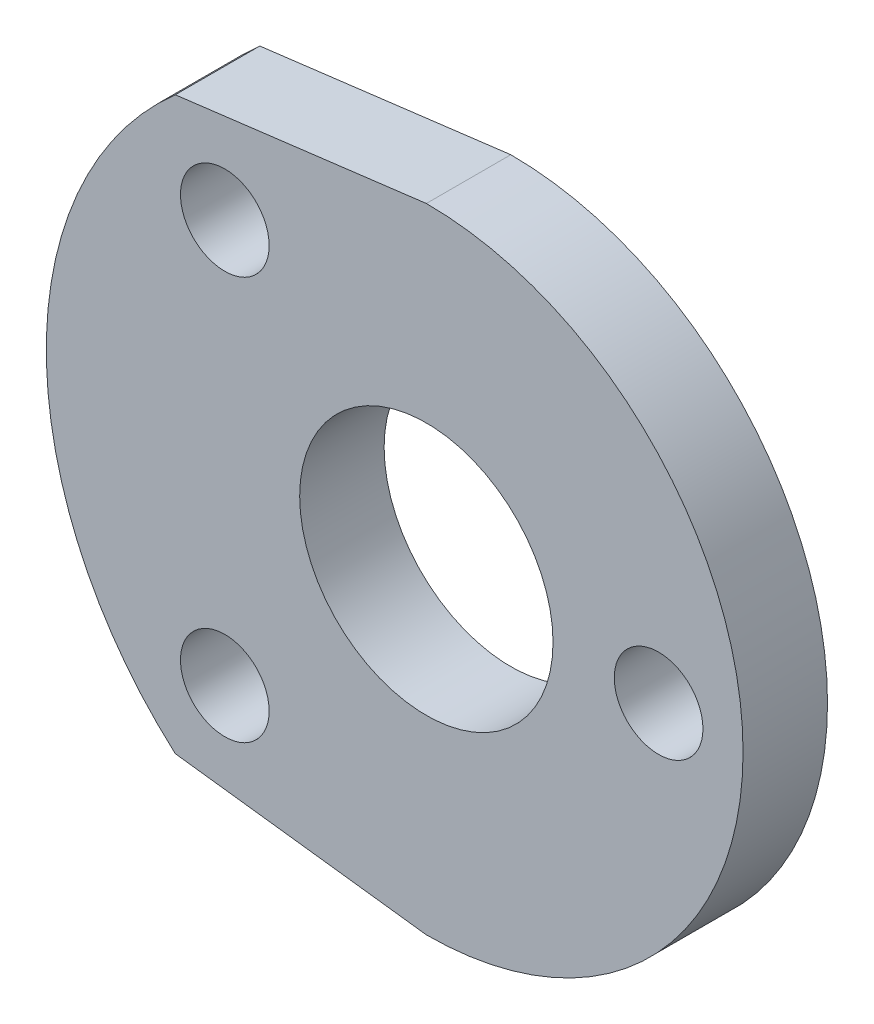
ISO-10303-21;
HEADER;
FILE_DESCRIPTION(('STEP AP214'),'2;1');
FILE_NAME('part.step','',(''),(''),'','','');
FILE_SCHEMA(('AUTOMOTIVE_DESIGN { 1 0 10303 214 1 1 1 1 }'));
ENDSEC;
DATA;
#1=APPLICATION_CONTEXT('core data for automotive mechanical design processes');
#2=APPLICATION_PROTOCOL_DEFINITION('international standard','automotive_design',2000,#1);
#3=PRODUCT_CONTEXT('',#1,'mechanical');
#4=PRODUCT('Part','Part','',(#3));
#5=PRODUCT_RELATED_PRODUCT_CATEGORY('part','',(#4));
#6=PRODUCT_DEFINITION_FORMATION('','',#4);
#7=PRODUCT_DEFINITION_CONTEXT('part definition',#1,'design');
#8=PRODUCT_DEFINITION('design','',#6,#7);
#9=PRODUCT_DEFINITION_SHAPE('','',#8);
#10=(LENGTH_UNIT() NAMED_UNIT(*) SI_UNIT(.MILLI.,.METRE.));
#11=(NAMED_UNIT(*) PLANE_ANGLE_UNIT() SI_UNIT($,.RADIAN.));
#12=(NAMED_UNIT(*) SI_UNIT($,.STERADIAN.) SOLID_ANGLE_UNIT());
#13=UNCERTAINTY_MEASURE_WITH_UNIT(LENGTH_MEASURE(1.E-05),#10,'distance_accuracy_value','');
#14=(GEOMETRIC_REPRESENTATION_CONTEXT(3) GLOBAL_UNCERTAINTY_ASSIGNED_CONTEXT((#13)) GLOBAL_UNIT_ASSIGNED_CONTEXT((#10,
#11,#12)) REPRESENTATION_CONTEXT('',''));
#15=CARTESIAN_POINT('',(0.,0.,0.));
#16=DIRECTION('',(0.,0.,1.));
#17=DIRECTION('',(1.,0.,0.));
#18=AXIS2_PLACEMENT_3D('',#15,#16,#17);
#19=CARTESIAN_POINT('',(0.,0.,2.));
#20=DIRECTION('',(0.,0.,-1.));
#21=DIRECTION('',(-1.,0.,0.));
#22=AXIS2_PLACEMENT_3D('',#19,#20,#21);
#23=CYLINDRICAL_SURFACE('',#22,9.);
#24=CARTESIAN_POINT('',(0.,0.,0.));
#25=DIRECTION('',(0.,0.,1.));
#26=DIRECTION('',(1.,0.,0.));
#27=AXIS2_PLACEMENT_3D('',#24,#25,#26);
#28=CIRCLE('',#27,9.);
#29=CARTESIAN_POINT('',(-5.94515834168693,6.75685520728913,0.));
#30=VERTEX_POINT('',#29);
#31=CARTESIAN_POINT('',(-5.94515834168693,-6.75685520728914,0.));
#32=VERTEX_POINT('',#31);
#33=EDGE_CURVE('E115',#30,#32,#28,.T.);
#34=ORIENTED_EDGE('',*,*,#33,.T.);
#35=DIRECTION('',(0.,0.,-1.));
#36=VECTOR('',#35,1.);
#37=CARTESIAN_POINT('',(-5.94515834168693,-6.75685520728914,2.));
#38=LINE('',#37,#36);
#39=CARTESIAN_POINT('',(-5.94515834168693,-6.75685520728914,2.));
#40=VERTEX_POINT('',#39);
#41=EDGE_CURVE('E11',#40,#32,#38,.T.);
#42=ORIENTED_EDGE('',*,*,#41,.F.);
#43=CARTESIAN_POINT('',(0.,0.,2.));
#44=DIRECTION('',(0.,0.,1.));
#45=DIRECTION('',(1.,0.,0.));
#46=AXIS2_PLACEMENT_3D('',#43,#44,#45);
#47=CIRCLE('',#46,9.);
#48=CARTESIAN_POINT('',(-5.94515834168693,6.75685520728913,2.));
#49=VERTEX_POINT('',#48);
#50=EDGE_CURVE('E78',#49,#40,#47,.T.);
#51=ORIENTED_EDGE('',*,*,#50,.F.);
#52=DIRECTION('',(0.,0.,-1.));
#53=VECTOR('',#52,1.);
#54=CARTESIAN_POINT('',(-5.94515834168693,6.75685520728913,2.));
#55=LINE('',#54,#53);
#56=EDGE_CURVE('E53',#49,#30,#55,.T.);
#57=ORIENTED_EDGE('',*,*,#56,.T.);
#58=EDGE_LOOP('',(#34,#42,#51,#57));
#59=FACE_BOUND('',#58,.T.);
#60=ADVANCED_FACE('F36',(#59),#23,.T.);
#61=CARTESIAN_POINT('',(-0.923076923076922,-7.38461538461538,2.));
#62=DIRECTION('',(-0.124034734589208,-0.992277876713668,0.));
#63=DIRECTION('',(0.992277876713668,-0.124034734589208,0.));
#64=AXIS2_PLACEMENT_3D('',#61,#62,#63);
#65=PLANE('',#64);
#66=DIRECTION('',(-0.992277876713668,0.124034734589208,0.));
#67=VECTOR('',#66,1.);
#68=CARTESIAN_POINT('',(-0.923076923076922,-7.38461538461538,0.));
#69=LINE('',#68,#67);
#70=CARTESIAN_POINT('',(0.,-7.5,0.));
#71=VERTEX_POINT('',#70);
#72=EDGE_CURVE('E88',#71,#32,#69,.T.);
#73=ORIENTED_EDGE('',*,*,#72,.F.);
#74=DIRECTION('',(0.,0.,-1.));
#75=VECTOR('',#74,1.);
#76=CARTESIAN_POINT('',(0.,-7.5,2.));
#77=LINE('',#76,#75);
#78=CARTESIAN_POINT('',(0.,-7.5,2.));
#79=VERTEX_POINT('',#78);
#80=EDGE_CURVE('E45',#79,#71,#77,.T.);
#81=ORIENTED_EDGE('',*,*,#80,.F.);
#82=DIRECTION('',(-0.992277876713668,0.124034734589208,0.));
#83=VECTOR('',#82,1.);
#84=CARTESIAN_POINT('',(-0.923076923076922,-7.38461538461538,2.));
#85=LINE('',#84,#83);
#86=EDGE_CURVE('E86',#79,#40,#85,.T.);
#87=ORIENTED_EDGE('',*,*,#86,.T.);
#88=ORIENTED_EDGE('',*,*,#41,.T.);
#89=EDGE_LOOP('',(#73,#81,#87,#88));
#90=FACE_BOUND('',#89,.T.);
#91=ADVANCED_FACE('F85',(#90),#65,.T.);
#92=CARTESIAN_POINT('',(0.,0.,2.));
#93=DIRECTION('',(0.,0.,-1.));
#94=DIRECTION('',(-1.,0.,0.));
#95=AXIS2_PLACEMENT_3D('',#92,#93,#94);
#96=CYLINDRICAL_SURFACE('',#95,7.5);
#97=CARTESIAN_POINT('',(0.,0.,0.));
#98=DIRECTION('',(0.,0.,1.));
#99=DIRECTION('',(1.,0.,0.));
#100=AXIS2_PLACEMENT_3D('',#97,#98,#99);
#101=CIRCLE('',#100,7.5);
#102=CARTESIAN_POINT('',(0.,7.5,0.));
#103=VERTEX_POINT('',#102);
#104=EDGE_CURVE('E118',#71,#103,#101,.T.);
#105=ORIENTED_EDGE('',*,*,#104,.T.);
#106=DIRECTION('',(0.,0.,-1.));
#107=VECTOR('',#106,1.);
#108=CARTESIAN_POINT('',(0.,7.5,2.));
#109=LINE('',#108,#107);
#110=CARTESIAN_POINT('',(0.,7.5,2.));
#111=VERTEX_POINT('',#110);
#112=EDGE_CURVE('E67',#111,#103,#109,.T.);
#113=ORIENTED_EDGE('',*,*,#112,.F.);
#114=CARTESIAN_POINT('',(0.,0.,2.));
#115=DIRECTION('',(0.,0.,1.));
#116=DIRECTION('',(1.,0.,0.));
#117=AXIS2_PLACEMENT_3D('',#114,#115,#116);
#118=CIRCLE('',#117,7.5);
#119=EDGE_CURVE('E91',#79,#111,#118,.T.);
#120=ORIENTED_EDGE('',*,*,#119,.F.);
#121=ORIENTED_EDGE('',*,*,#80,.T.);
#122=EDGE_LOOP('',(#105,#113,#120,#121));
#123=FACE_BOUND('',#122,.T.);
#124=ADVANCED_FACE('F92',(#123),#96,.T.);
#125=CARTESIAN_POINT('',(5.5,0.,2.));
#126=DIRECTION('',(0.,0.,-1.));
#127=DIRECTION('',(-1.,0.,0.));
#128=AXIS2_PLACEMENT_3D('',#125,#126,#127);
#129=CYLINDRICAL_SURFACE('',#128,1.05);
#130=CARTESIAN_POINT('',(5.5,0.,2.));
#131=DIRECTION('',(0.,0.,1.));
#132=DIRECTION('',(1.,0.,0.));
#133=AXIS2_PLACEMENT_3D('',#130,#131,#132);
#134=CIRCLE('',#133,1.05);
#135=CARTESIAN_POINT('',(6.55,0.,2.));
#136=VERTEX_POINT('',#135);
#137=EDGE_CURVE('E106',#136,#136,#134,.T.);
#138=ORIENTED_EDGE('',*,*,#137,.T.);
#139=EDGE_LOOP('',(#138));
#140=FACE_BOUND('',#139,.T.);
#141=CARTESIAN_POINT('',(5.5,0.,0.));
#142=DIRECTION('',(0.,0.,1.));
#143=DIRECTION('',(1.,0.,0.));
#144=AXIS2_PLACEMENT_3D('',#141,#142,#143);
#145=CIRCLE('',#144,1.05);
#146=CARTESIAN_POINT('',(6.55,0.,0.));
#147=VERTEX_POINT('',#146);
#148=EDGE_CURVE('E126',#147,#147,#145,.T.);
#149=ORIENTED_EDGE('',*,*,#148,.F.);
#150=EDGE_LOOP('',(#149));
#151=FACE_BOUND('',#150,.T.);
#152=ADVANCED_FACE('F154',(#140,#151),#129,.F.);
#153=CARTESIAN_POINT('',(0.,0.,2.));
#154=DIRECTION('',(0.,0.,-1.));
#155=DIRECTION('',(-1.,0.,0.));
#156=AXIS2_PLACEMENT_3D('',#153,#154,#155);
#157=CYLINDRICAL_SURFACE('',#156,3.);
#158=CARTESIAN_POINT('',(0.,0.,2.));
#159=DIRECTION('',(0.,0.,1.));
#160=DIRECTION('',(1.,0.,0.));
#161=AXIS2_PLACEMENT_3D('',#158,#159,#160);
#162=CIRCLE('',#161,3.);
#163=CARTESIAN_POINT('',(3.,0.,2.));
#164=VERTEX_POINT('',#163);
#165=EDGE_CURVE('E103',#164,#164,#162,.T.);
#166=ORIENTED_EDGE('',*,*,#165,.T.);
#167=EDGE_LOOP('',(#166));
#168=FACE_BOUND('',#167,.T.);
#169=CARTESIAN_POINT('',(0.,0.,0.));
#170=DIRECTION('',(0.,0.,1.));
#171=DIRECTION('',(1.,0.,0.));
#172=AXIS2_PLACEMENT_3D('',#169,#170,#171);
#173=CIRCLE('',#172,3.);
#174=CARTESIAN_POINT('',(3.,0.,0.));
#175=VERTEX_POINT('',#174);
#176=EDGE_CURVE('E123',#175,#175,#173,.T.);
#177=ORIENTED_EDGE('',*,*,#176,.F.);
#178=EDGE_LOOP('',(#177));
#179=FACE_BOUND('',#178,.T.);
#180=ADVANCED_FACE('F156',(#168,#179),#157,.F.);
#181=CARTESIAN_POINT('',(-0.923076923076922,7.38461538461538,2.));
#182=DIRECTION('',(-0.124034734589208,0.992277876713668,0.));
#183=DIRECTION('',(-0.992277876713668,-0.124034734589208,0.));
#184=AXIS2_PLACEMENT_3D('',#181,#182,#183);
#185=PLANE('',#184);
#186=DIRECTION('',(0.992277876713668,0.124034734589208,0.));
#187=VECTOR('',#186,1.);
#188=CARTESIAN_POINT('',(-0.923076923076922,7.38461538461538,0.));
#189=LINE('',#188,#187);
#190=EDGE_CURVE('E120',#30,#103,#189,.T.);
#191=ORIENTED_EDGE('',*,*,#190,.F.);
#192=ORIENTED_EDGE('',*,*,#56,.F.);
#193=DIRECTION('',(0.992277876713668,0.124034734589208,0.));
#194=VECTOR('',#193,1.);
#195=CARTESIAN_POINT('',(-0.923076923076922,7.38461538461538,2.));
#196=LINE('',#195,#194);
#197=EDGE_CURVE('E93',#49,#111,#196,.T.);
#198=ORIENTED_EDGE('',*,*,#197,.T.);
#199=ORIENTED_EDGE('',*,*,#112,.T.);
#200=EDGE_LOOP('',(#191,#192,#198,#199));
#201=FACE_BOUND('',#200,.T.);
#202=ADVANCED_FACE('F142',(#201),#185,.T.);
#203=CARTESIAN_POINT('',(-4.77297077300922,-4.77297077300917,2.));
#204=DIRECTION('',(0.,0.,-1.));
#205=DIRECTION('',(-1.,0.,0.));
#206=AXIS2_PLACEMENT_3D('',#203,#204,#205);
#207=CYLINDRICAL_SURFACE('',#206,1.05);
#208=CARTESIAN_POINT('',(-4.77297077300922,-4.77297077300917,2.));
#209=DIRECTION('',(0.,0.,1.));
#210=DIRECTION('',(1.,0.,0.));
#211=AXIS2_PLACEMENT_3D('',#208,#209,#210);
#212=CIRCLE('',#211,1.05);
#213=CARTESIAN_POINT('',(-3.72297077300922,-4.77297077300917,2.));
#214=VERTEX_POINT('',#213);
#215=EDGE_CURVE('E98',#214,#214,#212,.F.);
#216=ORIENTED_EDGE('',*,*,#215,.F.);
#217=EDGE_LOOP('',(#216));
#218=FACE_BOUND('',#217,.T.);
#219=CARTESIAN_POINT('',(-4.77297077300922,-4.77297077300917,0.));
#220=DIRECTION('',(0.,0.,1.));
#221=DIRECTION('',(1.,0.,0.));
#222=AXIS2_PLACEMENT_3D('',#219,#220,#221);
#223=CIRCLE('',#222,1.05);
#224=CARTESIAN_POINT('',(-3.72297077300922,-4.77297077300917,0.));
#225=VERTEX_POINT('',#224);
#226=EDGE_CURVE('E112',#225,#225,#223,.F.);
#227=ORIENTED_EDGE('',*,*,#226,.T.);
#228=EDGE_LOOP('',(#227));
#229=FACE_BOUND('',#228,.T.);
#230=ADVANCED_FACE('F38',(#218,#229),#207,.F.);
#231=CARTESIAN_POINT('',(-4.77297077300922,4.77297077300917,2.));
#232=DIRECTION('',(0.,0.,-1.));
#233=DIRECTION('',(-1.,0.,0.));
#234=AXIS2_PLACEMENT_3D('',#231,#232,#233);
#235=CYLINDRICAL_SURFACE('',#234,1.05);
#236=CARTESIAN_POINT('',(-4.77297077300922,4.77297077300917,2.));
#237=DIRECTION('',(0.,0.,1.));
#238=DIRECTION('',(1.,0.,0.));
#239=AXIS2_PLACEMENT_3D('',#236,#237,#238);
#240=CIRCLE('',#239,1.05);
#241=CARTESIAN_POINT('',(-3.72297077300922,4.77297077300917,2.));
#242=VERTEX_POINT('',#241);
#243=EDGE_CURVE('E109',#242,#242,#240,.T.);
#244=ORIENTED_EDGE('',*,*,#243,.T.);
#245=EDGE_LOOP('',(#244));
#246=FACE_BOUND('',#245,.T.);
#247=CARTESIAN_POINT('',(-4.77297077300922,4.77297077300917,0.));
#248=DIRECTION('',(0.,0.,1.));
#249=DIRECTION('',(1.,0.,0.));
#250=AXIS2_PLACEMENT_3D('',#247,#248,#249);
#251=CIRCLE('',#250,1.05);
#252=CARTESIAN_POINT('',(-3.72297077300922,4.77297077300917,0.));
#253=VERTEX_POINT('',#252);
#254=EDGE_CURVE('E129',#253,#253,#251,.T.);
#255=ORIENTED_EDGE('',*,*,#254,.F.);
#256=EDGE_LOOP('',(#255));
#257=FACE_BOUND('',#256,.T.);
#258=ADVANCED_FACE('F141',(#246,#257),#235,.F.);
#259=CARTESIAN_POINT('',(0.,0.,2.));
#260=DIRECTION('',(0.,0.,1.));
#261=DIRECTION('',(1.,0.,0.));
#262=AXIS2_PLACEMENT_3D('',#259,#260,#261);
#263=PLANE('',#262);
#264=ORIENTED_EDGE('',*,*,#215,.T.);
#265=EDGE_LOOP('',(#264));
#266=FACE_BOUND('',#265,.T.);
#267=ORIENTED_EDGE('',*,*,#50,.T.);
#268=ORIENTED_EDGE('',*,*,#86,.F.);
#269=ORIENTED_EDGE('',*,*,#119,.T.);
#270=ORIENTED_EDGE('',*,*,#197,.F.);
#271=EDGE_LOOP('',(#267,#268,#269,#270));
#272=FACE_BOUND('',#271,.T.);
#273=ORIENTED_EDGE('',*,*,#165,.F.);
#274=EDGE_LOOP('',(#273));
#275=FACE_BOUND('',#274,.T.);
#276=ORIENTED_EDGE('',*,*,#137,.F.);
#277=EDGE_LOOP('',(#276));
#278=FACE_BOUND('',#277,.T.);
#279=ORIENTED_EDGE('',*,*,#243,.F.);
#280=EDGE_LOOP('',(#279));
#281=FACE_BOUND('',#280,.T.);
#282=ADVANCED_FACE('F95',(#266,#272,#275,#278,#281),#263,.T.);
#283=CARTESIAN_POINT('',(0.,0.,0.));
#284=DIRECTION('',(0.,0.,1.));
#285=DIRECTION('',(1.,0.,0.));
#286=AXIS2_PLACEMENT_3D('',#283,#284,#285);
#287=PLANE('',#286);
#288=ORIENTED_EDGE('',*,*,#226,.F.);
#289=EDGE_LOOP('',(#288));
#290=FACE_BOUND('',#289,.T.);
#291=ORIENTED_EDGE('',*,*,#33,.F.);
#292=ORIENTED_EDGE('',*,*,#190,.T.);
#293=ORIENTED_EDGE('',*,*,#104,.F.);
#294=ORIENTED_EDGE('',*,*,#72,.T.);
#295=EDGE_LOOP('',(#291,#292,#293,#294));
#296=FACE_BOUND('',#295,.T.);
#297=ORIENTED_EDGE('',*,*,#176,.T.);
#298=EDGE_LOOP('',(#297));
#299=FACE_BOUND('',#298,.T.);
#300=ORIENTED_EDGE('',*,*,#148,.T.);
#301=EDGE_LOOP('',(#300));
#302=FACE_BOUND('',#301,.T.);
#303=ORIENTED_EDGE('',*,*,#254,.T.);
#304=EDGE_LOOP('',(#303));
#305=FACE_BOUND('',#304,.T.);
#306=ADVANCED_FACE('F145',(#290,#296,#299,#302,#305),#287,.F.);
#307=CLOSED_SHELL('',(#60,#91,#124,#152,#180,#202,#230,#258,#282,#306));
#308=MANIFOLD_SOLID_BREP('B2',#307);
#309=ADVANCED_BREP_SHAPE_REPRESENTATION('',(#18,#308),#14);
#310=SHAPE_DEFINITION_REPRESENTATION(#9,#309);
ENDSEC;
END-ISO-10303-21;
